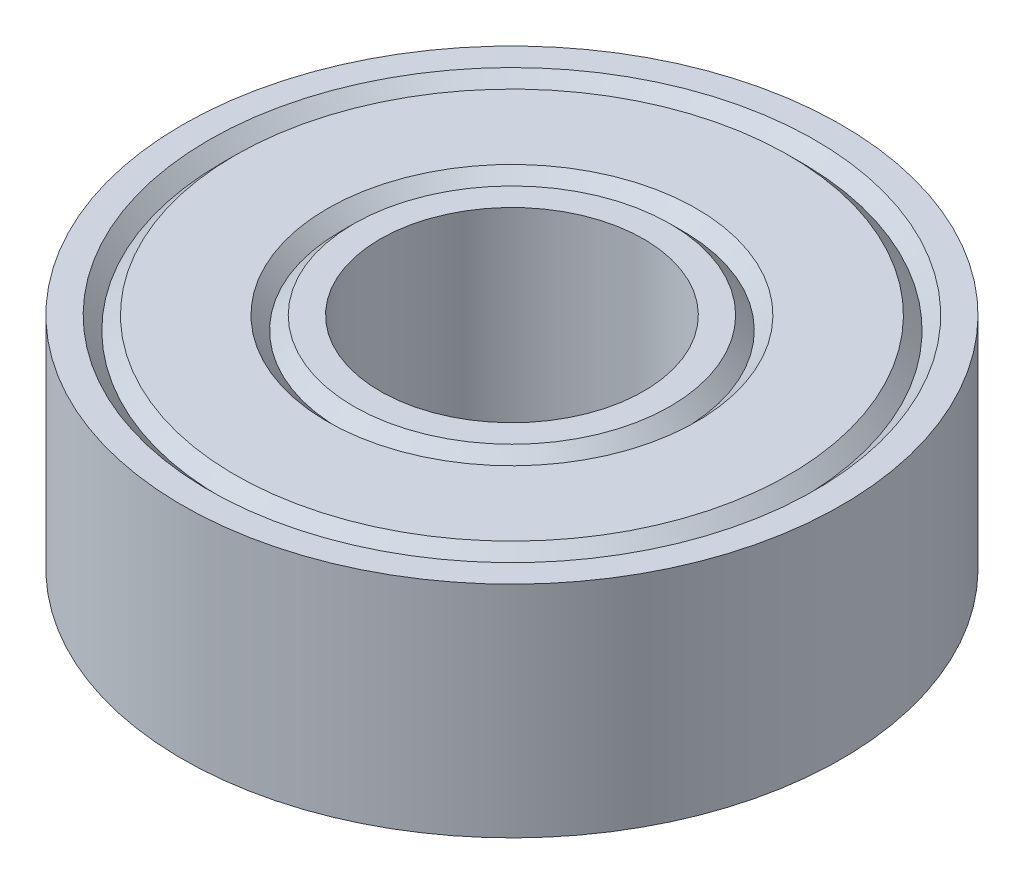
ISO-10303-21;
HEADER;
FILE_DESCRIPTION(('STEP AP214'),'2;1');
FILE_NAME('part.step','',(''),(''),'','','');
FILE_SCHEMA(('AUTOMOTIVE_DESIGN { 1 0 10303 214 1 1 1 1 }'));
ENDSEC;
DATA;
#1=APPLICATION_CONTEXT('core data for automotive mechanical design processes');
#2=APPLICATION_PROTOCOL_DEFINITION('international standard','automotive_design',2000,#1);
#3=PRODUCT_CONTEXT('',#1,'mechanical');
#4=PRODUCT('Part','Part','',(#3));
#5=PRODUCT_RELATED_PRODUCT_CATEGORY('part','',(#4));
#6=PRODUCT_DEFINITION_FORMATION('','',#4);
#7=PRODUCT_DEFINITION_CONTEXT('part definition',#1,'design');
#8=PRODUCT_DEFINITION('design','',#6,#7);
#9=PRODUCT_DEFINITION_SHAPE('','',#8);
#10=(LENGTH_UNIT() NAMED_UNIT(*) SI_UNIT(.MILLI.,.METRE.));
#11=(NAMED_UNIT(*) PLANE_ANGLE_UNIT() SI_UNIT($,.RADIAN.));
#12=(NAMED_UNIT(*) SI_UNIT($,.STERADIAN.) SOLID_ANGLE_UNIT());
#13=UNCERTAINTY_MEASURE_WITH_UNIT(LENGTH_MEASURE(1.E-05),#10,'distance_accuracy_value','');
#14=(GEOMETRIC_REPRESENTATION_CONTEXT(3) GLOBAL_UNCERTAINTY_ASSIGNED_CONTEXT((#13)) GLOBAL_UNIT_ASSIGNED_CONTEXT((#10,
#11,#12)) REPRESENTATION_CONTEXT('',''));
#15=CARTESIAN_POINT('',(0.,0.,0.));
#16=DIRECTION('',(0.,0.,1.));
#17=DIRECTION('',(1.,0.,0.));
#18=AXIS2_PLACEMENT_3D('',#15,#16,#17);
#19=CARTESIAN_POINT('',(0.,2.5,0.));
#20=DIRECTION('',(0.,1.,0.));
#21=DIRECTION('',(-1.,0.,0.));
#22=AXIS2_PLACEMENT_3D('',#19,#20,#21);
#23=CYLINDRICAL_SURFACE('',#22,3.);
#24=CARTESIAN_POINT('',(0.,2.5,0.));
#25=DIRECTION('',(0.,1.,0.));
#26=DIRECTION('',(-1.,0.,0.));
#27=AXIS2_PLACEMENT_3D('',#24,#25,#26);
#28=CIRCLE('',#27,3.);
#29=CARTESIAN_POINT('',(-3.,2.5,0.));
#30=VERTEX_POINT('',#29);
#31=EDGE_CURVE('E83',#30,#30,#28,.T.);
#32=ORIENTED_EDGE('',*,*,#31,.T.);
#33=EDGE_LOOP('',(#32));
#34=FACE_BOUND('',#33,.T.);
#35=CARTESIAN_POINT('',(0.,-2.5,0.));
#36=DIRECTION('',(0.,1.,0.));
#37=DIRECTION('',(-1.,0.,0.));
#38=AXIS2_PLACEMENT_3D('',#35,#36,#37);
#39=CIRCLE('',#38,3.00000000000001);
#40=CARTESIAN_POINT('',(-3.,-2.5,0.));
#41=VERTEX_POINT('',#40);
#42=EDGE_CURVE('E10',#41,#41,#39,.T.);
#43=ORIENTED_EDGE('',*,*,#42,.F.);
#44=EDGE_LOOP('',(#43));
#45=FACE_BOUND('',#44,.T.);
#46=ADVANCED_FACE('F31',(#34,#45),#23,.F.);
#47=CARTESIAN_POINT('',(-3.,-2.5,0.));
#48=DIRECTION('',(0.,-1.,0.));
#49=DIRECTION('',(1.,0.,0.));
#50=AXIS2_PLACEMENT_3D('',#47,#48,#49);
#51=PLANE('',#50);
#52=ORIENTED_EDGE('',*,*,#42,.T.);
#53=EDGE_LOOP('',(#52));
#54=FACE_BOUND('',#53,.T.);
#55=CARTESIAN_POINT('',(0.,-2.5,0.));
#56=DIRECTION('',(0.,1.,0.));
#57=DIRECTION('',(-1.,0.,0.));
#58=AXIS2_PLACEMENT_3D('',#55,#56,#57);
#59=CIRCLE('',#58,3.60000000000001);
#60=CARTESIAN_POINT('',(-3.6,-2.5,0.));
#61=VERTEX_POINT('',#60);
#62=EDGE_CURVE('E37',#61,#61,#59,.T.);
#63=ORIENTED_EDGE('',*,*,#62,.F.);
#64=EDGE_LOOP('',(#63));
#65=FACE_BOUND('',#64,.T.);
#66=ADVANCED_FACE('F101',(#54,#65),#51,.T.);
#67=CARTESIAN_POINT('',(0.,-2.2,0.));
#68=DIRECTION('',(0.,1.,0.));
#69=DIRECTION('',(-1.,0.,0.));
#70=AXIS2_PLACEMENT_3D('',#67,#68,#69);
#71=CONICAL_SURFACE('',#70,3.9,0.785398163397451);
#72=ORIENTED_EDGE('',*,*,#62,.T.);
#73=EDGE_LOOP('',(#72));
#74=FACE_BOUND('',#73,.T.);
#75=CARTESIAN_POINT('',(0.,-2.2,0.));
#76=DIRECTION('',(0.,1.,0.));
#77=DIRECTION('',(-1.,0.,0.));
#78=AXIS2_PLACEMENT_3D('',#75,#76,#77);
#79=CIRCLE('',#78,3.90000000000001);
#80=CARTESIAN_POINT('',(-3.9,-2.2,0.));
#81=VERTEX_POINT('',#80);
#82=EDGE_CURVE('E41',#81,#81,#79,.T.);
#83=ORIENTED_EDGE('',*,*,#82,.F.);
#84=EDGE_LOOP('',(#83));
#85=FACE_BOUND('',#84,.T.);
#86=ADVANCED_FACE('F105',(#74,#85),#71,.T.);
#87=CARTESIAN_POINT('',(0.,-2.5,0.));
#88=DIRECTION('',(0.,-1.,0.));
#89=DIRECTION('',(1.,0.,0.));
#90=AXIS2_PLACEMENT_3D('',#87,#88,#89);
#91=CONICAL_SURFACE('',#90,4.2,0.78539816339745);
#92=ORIENTED_EDGE('',*,*,#82,.T.);
#93=EDGE_LOOP('',(#92));
#94=FACE_BOUND('',#93,.T.);
#95=CARTESIAN_POINT('',(0.,-2.5,0.));
#96=DIRECTION('',(0.,1.,0.));
#97=DIRECTION('',(-1.,0.,0.));
#98=AXIS2_PLACEMENT_3D('',#95,#96,#97);
#99=CIRCLE('',#98,4.2);
#100=CARTESIAN_POINT('',(-4.2,-2.5,0.));
#101=VERTEX_POINT('',#100);
#102=EDGE_CURVE('E45',#101,#101,#99,.T.);
#103=ORIENTED_EDGE('',*,*,#102,.F.);
#104=EDGE_LOOP('',(#103));
#105=FACE_BOUND('',#104,.T.);
#106=ADVANCED_FACE('F109',(#94,#105),#91,.F.);
#107=CARTESIAN_POINT('',(-4.2,-2.5,0.));
#108=DIRECTION('',(0.,-1.,0.));
#109=DIRECTION('',(1.,0.,0.));
#110=AXIS2_PLACEMENT_3D('',#107,#108,#109);
#111=PLANE('',#110);
#112=ORIENTED_EDGE('',*,*,#102,.T.);
#113=EDGE_LOOP('',(#112));
#114=FACE_BOUND('',#113,.T.);
#115=CARTESIAN_POINT('',(0.,-2.5,0.));
#116=DIRECTION('',(0.,1.,0.));
#117=DIRECTION('',(-1.,0.,0.));
#118=AXIS2_PLACEMENT_3D('',#115,#116,#117);
#119=CIRCLE('',#118,6.3);
#120=CARTESIAN_POINT('',(-6.29999999999999,-2.5,0.));
#121=VERTEX_POINT('',#120);
#122=EDGE_CURVE('E50',#121,#121,#119,.T.);
#123=ORIENTED_EDGE('',*,*,#122,.F.);
#124=EDGE_LOOP('',(#123));
#125=FACE_BOUND('',#124,.T.);
#126=ADVANCED_FACE('F115',(#114,#125),#111,.T.);
#127=CARTESIAN_POINT('',(0.,-2.19999999999999,0.));
#128=DIRECTION('',(0.,1.,0.));
#129=DIRECTION('',(-1.,0.,0.));
#130=AXIS2_PLACEMENT_3D('',#127,#128,#129);
#131=CONICAL_SURFACE('',#130,6.6,0.785398163397453);
#132=ORIENTED_EDGE('',*,*,#122,.T.);
#133=EDGE_LOOP('',(#132));
#134=FACE_BOUND('',#133,.T.);
#135=CARTESIAN_POINT('',(0.,-2.19999999999999,0.));
#136=DIRECTION('',(0.,1.,0.));
#137=DIRECTION('',(-1.,0.,0.));
#138=AXIS2_PLACEMENT_3D('',#135,#136,#137);
#139=CIRCLE('',#138,6.6);
#140=CARTESIAN_POINT('',(-6.6,-2.2,0.));
#141=VERTEX_POINT('',#140);
#142=EDGE_CURVE('E53',#141,#141,#139,.T.);
#143=ORIENTED_EDGE('',*,*,#142,.F.);
#144=EDGE_LOOP('',(#143));
#145=FACE_BOUND('',#144,.T.);
#146=ADVANCED_FACE('F119',(#134,#145),#131,.T.);
#147=CARTESIAN_POINT('',(0.,-2.49999999999999,0.));
#148=DIRECTION('',(0.,-1.,0.));
#149=DIRECTION('',(1.,0.,0.));
#150=AXIS2_PLACEMENT_3D('',#147,#148,#149);
#151=CONICAL_SURFACE('',#150,6.9,0.785398163397443);
#152=ORIENTED_EDGE('',*,*,#142,.T.);
#153=EDGE_LOOP('',(#152));
#154=FACE_BOUND('',#153,.T.);
#155=CARTESIAN_POINT('',(0.,-2.49999999999999,0.));
#156=DIRECTION('',(0.,1.,0.));
#157=DIRECTION('',(-1.,0.,0.));
#158=AXIS2_PLACEMENT_3D('',#155,#156,#157);
#159=CIRCLE('',#158,6.9);
#160=CARTESIAN_POINT('',(-6.89999999999999,-2.5,0.));
#161=VERTEX_POINT('',#160);
#162=EDGE_CURVE('E56',#161,#161,#159,.T.);
#163=ORIENTED_EDGE('',*,*,#162,.F.);
#164=EDGE_LOOP('',(#163));
#165=FACE_BOUND('',#164,.T.);
#166=ADVANCED_FACE('F123',(#154,#165),#151,.F.);
#167=CARTESIAN_POINT('',(-6.89999999999999,-2.5,0.));
#168=DIRECTION('',(0.,-1.,0.));
#169=DIRECTION('',(1.,0.,0.));
#170=AXIS2_PLACEMENT_3D('',#167,#168,#169);
#171=PLANE('',#170);
#172=ORIENTED_EDGE('',*,*,#162,.T.);
#173=EDGE_LOOP('',(#172));
#174=FACE_BOUND('',#173,.T.);
#175=CARTESIAN_POINT('',(0.,-2.49999999999999,0.));
#176=DIRECTION('',(0.,1.,0.));
#177=DIRECTION('',(-1.,0.,0.));
#178=AXIS2_PLACEMENT_3D('',#175,#176,#177);
#179=CIRCLE('',#178,7.50000000000001);
#180=CARTESIAN_POINT('',(-7.5,-2.5,0.));
#181=VERTEX_POINT('',#180);
#182=EDGE_CURVE('E59',#181,#181,#179,.T.);
#183=ORIENTED_EDGE('',*,*,#182,.F.);
#184=EDGE_LOOP('',(#183));
#185=FACE_BOUND('',#184,.T.);
#186=ADVANCED_FACE('F127',(#174,#185),#171,.T.);
#187=CARTESIAN_POINT('',(0.,2.5,0.));
#188=DIRECTION('',(0.,1.,0.));
#189=DIRECTION('',(-1.,0.,0.));
#190=AXIS2_PLACEMENT_3D('',#187,#188,#189);
#191=CYLINDRICAL_SURFACE('',#190,7.5);
#192=ORIENTED_EDGE('',*,*,#182,.T.);
#193=EDGE_LOOP('',(#192));
#194=FACE_BOUND('',#193,.T.);
#195=CARTESIAN_POINT('',(0.,2.50000000000001,0.));
#196=DIRECTION('',(0.,1.,0.));
#197=DIRECTION('',(-1.,0.,0.));
#198=AXIS2_PLACEMENT_3D('',#195,#196,#197);
#199=CIRCLE('',#198,7.49999999999999);
#200=CARTESIAN_POINT('',(-7.49999999999999,2.5,0.));
#201=VERTEX_POINT('',#200);
#202=EDGE_CURVE('E62',#201,#201,#199,.T.);
#203=ORIENTED_EDGE('',*,*,#202,.F.);
#204=EDGE_LOOP('',(#203));
#205=FACE_BOUND('',#204,.T.);
#206=ADVANCED_FACE('F131',(#194,#205),#191,.T.);
#207=CARTESIAN_POINT('',(-6.9,2.5,0.));
#208=DIRECTION('',(0.,1.,0.));
#209=DIRECTION('',(-1.,0.,0.));
#210=AXIS2_PLACEMENT_3D('',#207,#208,#209);
#211=PLANE('',#210);
#212=ORIENTED_EDGE('',*,*,#202,.T.);
#213=EDGE_LOOP('',(#212));
#214=FACE_BOUND('',#213,.T.);
#215=CARTESIAN_POINT('',(0.,2.50000000000001,0.));
#216=DIRECTION('',(0.,1.,0.));
#217=DIRECTION('',(-1.,0.,0.));
#218=AXIS2_PLACEMENT_3D('',#215,#216,#217);
#219=CIRCLE('',#218,6.9);
#220=CARTESIAN_POINT('',(-6.9,2.5,0.));
#221=VERTEX_POINT('',#220);
#222=EDGE_CURVE('E65',#221,#221,#219,.T.);
#223=ORIENTED_EDGE('',*,*,#222,.F.);
#224=EDGE_LOOP('',(#223));
#225=FACE_BOUND('',#224,.T.);
#226=ADVANCED_FACE('F135',(#214,#225),#211,.T.);
#227=CARTESIAN_POINT('',(0.,2.20000000000001,0.));
#228=DIRECTION('',(0.,1.,0.));
#229=DIRECTION('',(-1.,0.,0.));
#230=AXIS2_PLACEMENT_3D('',#227,#228,#229);
#231=CONICAL_SURFACE('',#230,6.6,0.785398163397448);
#232=ORIENTED_EDGE('',*,*,#222,.T.);
#233=EDGE_LOOP('',(#232));
#234=FACE_BOUND('',#233,.T.);
#235=CARTESIAN_POINT('',(0.,2.20000000000001,0.));
#236=DIRECTION('',(0.,1.,0.));
#237=DIRECTION('',(-1.,0.,0.));
#238=AXIS2_PLACEMENT_3D('',#235,#236,#237);
#239=CIRCLE('',#238,6.59999999999999);
#240=CARTESIAN_POINT('',(-6.59999999999999,2.2,0.));
#241=VERTEX_POINT('',#240);
#242=EDGE_CURVE('E68',#241,#241,#239,.T.);
#243=ORIENTED_EDGE('',*,*,#242,.F.);
#244=EDGE_LOOP('',(#243));
#245=FACE_BOUND('',#244,.T.);
#246=ADVANCED_FACE('F139',(#234,#245),#231,.F.);
#247=CARTESIAN_POINT('',(0.,2.50000000000001,0.));
#248=DIRECTION('',(0.,-1.,0.));
#249=DIRECTION('',(1.,0.,0.));
#250=AXIS2_PLACEMENT_3D('',#247,#248,#249);
#251=CONICAL_SURFACE('',#250,6.29999999999999,0.785398163397449);
#252=ORIENTED_EDGE('',*,*,#242,.T.);
#253=EDGE_LOOP('',(#252));
#254=FACE_BOUND('',#253,.T.);
#255=CARTESIAN_POINT('',(0.,2.50000000000001,0.));
#256=DIRECTION('',(0.,1.,0.));
#257=DIRECTION('',(-1.,0.,0.));
#258=AXIS2_PLACEMENT_3D('',#255,#256,#257);
#259=CIRCLE('',#258,6.29999999999999);
#260=CARTESIAN_POINT('',(-6.29999999999999,2.5,0.));
#261=VERTEX_POINT('',#260);
#262=EDGE_CURVE('E71',#261,#261,#259,.T.);
#263=ORIENTED_EDGE('',*,*,#262,.F.);
#264=EDGE_LOOP('',(#263));
#265=FACE_BOUND('',#264,.T.);
#266=ADVANCED_FACE('F143',(#254,#265),#251,.T.);
#267=CARTESIAN_POINT('',(-4.2,2.5,0.));
#268=DIRECTION('',(0.,1.,0.));
#269=DIRECTION('',(-1.,0.,0.));
#270=AXIS2_PLACEMENT_3D('',#267,#268,#269);
#271=PLANE('',#270);
#272=ORIENTED_EDGE('',*,*,#262,.T.);
#273=EDGE_LOOP('',(#272));
#274=FACE_BOUND('',#273,.T.);
#275=CARTESIAN_POINT('',(0.,2.50000000000001,0.));
#276=DIRECTION('',(0.,1.,0.));
#277=DIRECTION('',(-1.,0.,0.));
#278=AXIS2_PLACEMENT_3D('',#275,#276,#277);
#279=CIRCLE('',#278,4.2);
#280=CARTESIAN_POINT('',(-4.2,2.5,0.));
#281=VERTEX_POINT('',#280);
#282=EDGE_CURVE('E74',#281,#281,#279,.T.);
#283=ORIENTED_EDGE('',*,*,#282,.F.);
#284=EDGE_LOOP('',(#283));
#285=FACE_BOUND('',#284,.T.);
#286=ADVANCED_FACE('F147',(#274,#285),#271,.T.);
#287=CARTESIAN_POINT('',(0.,2.20000000000001,0.));
#288=DIRECTION('',(0.,1.,0.));
#289=DIRECTION('',(-1.,0.,0.));
#290=AXIS2_PLACEMENT_3D('',#287,#288,#289);
#291=CONICAL_SURFACE('',#290,3.9,0.785398163397447);
#292=ORIENTED_EDGE('',*,*,#282,.T.);
#293=EDGE_LOOP('',(#292));
#294=FACE_BOUND('',#293,.T.);
#295=CARTESIAN_POINT('',(0.,2.20000000000001,0.));
#296=DIRECTION('',(0.,1.,0.));
#297=DIRECTION('',(-1.,0.,0.));
#298=AXIS2_PLACEMENT_3D('',#295,#296,#297);
#299=CIRCLE('',#298,3.9);
#300=CARTESIAN_POINT('',(-3.9,2.2,0.));
#301=VERTEX_POINT('',#300);
#302=EDGE_CURVE('E77',#301,#301,#299,.T.);
#303=ORIENTED_EDGE('',*,*,#302,.F.);
#304=EDGE_LOOP('',(#303));
#305=FACE_BOUND('',#304,.T.);
#306=ADVANCED_FACE('F97',(#294,#305),#291,.F.);
#307=CARTESIAN_POINT('',(0.,2.5,0.));
#308=DIRECTION('',(0.,-1.,0.));
#309=DIRECTION('',(1.,0.,0.));
#310=AXIS2_PLACEMENT_3D('',#307,#308,#309);
#311=CONICAL_SURFACE('',#310,3.6,0.78539816339745);
#312=ORIENTED_EDGE('',*,*,#302,.T.);
#313=EDGE_LOOP('',(#312));
#314=FACE_BOUND('',#313,.T.);
#315=CARTESIAN_POINT('',(0.,2.5,0.));
#316=DIRECTION('',(0.,1.,0.));
#317=DIRECTION('',(-1.,0.,0.));
#318=AXIS2_PLACEMENT_3D('',#315,#316,#317);
#319=CIRCLE('',#318,3.6);
#320=CARTESIAN_POINT('',(-3.6,2.5,0.));
#321=VERTEX_POINT('',#320);
#322=EDGE_CURVE('E80',#321,#321,#319,.T.);
#323=ORIENTED_EDGE('',*,*,#322,.F.);
#324=EDGE_LOOP('',(#323));
#325=FACE_BOUND('',#324,.T.);
#326=ADVANCED_FACE('F91',(#314,#325),#311,.T.);
#327=CARTESIAN_POINT('',(-3.,2.5,0.));
#328=DIRECTION('',(0.,1.,0.));
#329=DIRECTION('',(-1.,0.,0.));
#330=AXIS2_PLACEMENT_3D('',#327,#328,#329);
#331=PLANE('',#330);
#332=ORIENTED_EDGE('',*,*,#322,.T.);
#333=EDGE_LOOP('',(#332));
#334=FACE_BOUND('',#333,.T.);
#335=ORIENTED_EDGE('',*,*,#31,.F.);
#336=EDGE_LOOP('',(#335));
#337=FACE_BOUND('',#336,.T.);
#338=ADVANCED_FACE('F89',(#334,#337),#331,.T.);
#339=CLOSED_SHELL('',(#46,#66,#86,#106,#126,#146,#166,#186,#206,#226,#246,#266,#286,#306,#326,#338));
#340=MANIFOLD_SOLID_BREP('B2',#339);
#341=ADVANCED_BREP_SHAPE_REPRESENTATION('',(#18,#340),#14);
#342=SHAPE_DEFINITION_REPRESENTATION(#9,#341);
ENDSEC;
END-ISO-10303-21;
